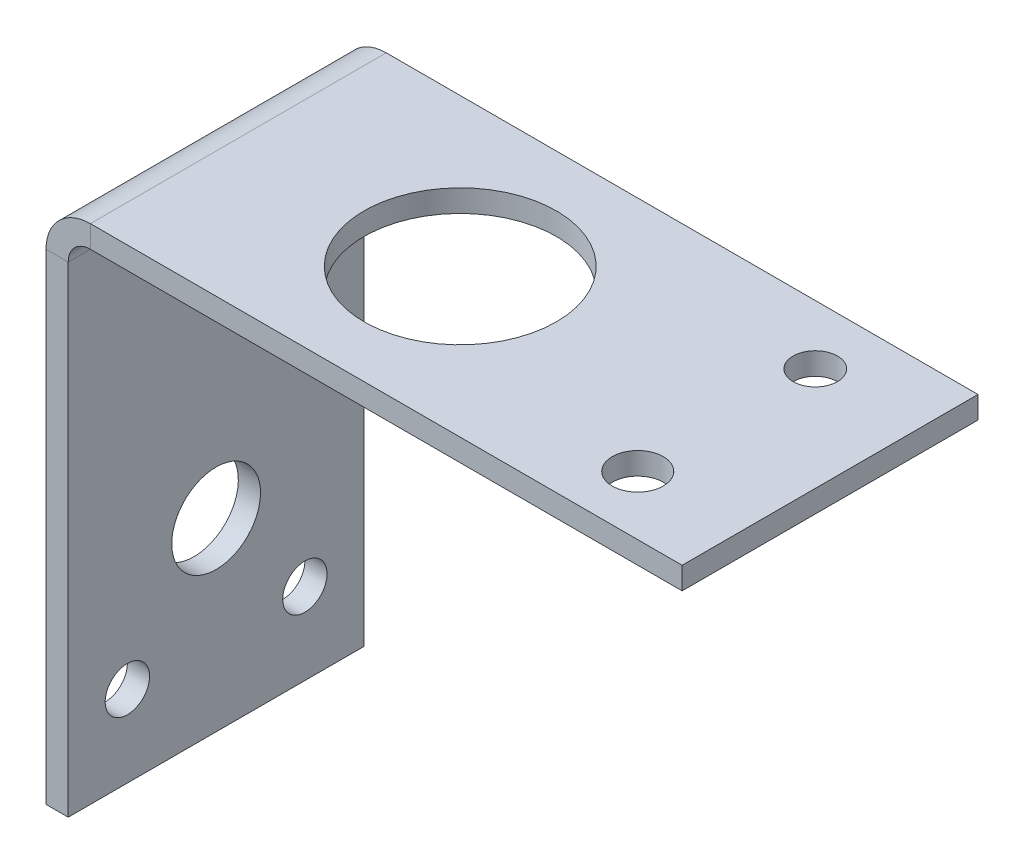
ISO-10303-21;
HEADER;
FILE_DESCRIPTION(('STEP AP214'),'2;1');
FILE_NAME('part.step','',(''),(''),'','','');
FILE_SCHEMA(('AUTOMOTIVE_DESIGN { 1 0 10303 214 1 1 1 1 }'));
ENDSEC;
DATA;
#1=APPLICATION_CONTEXT('core data for automotive mechanical design processes');
#2=APPLICATION_PROTOCOL_DEFINITION('international standard','automotive_design',2000,#1);
#3=PRODUCT_CONTEXT('',#1,'mechanical');
#4=PRODUCT('Part','Part','',(#3));
#5=PRODUCT_RELATED_PRODUCT_CATEGORY('part','',(#4));
#6=PRODUCT_DEFINITION_FORMATION('','',#4);
#7=PRODUCT_DEFINITION_CONTEXT('part definition',#1,'design');
#8=PRODUCT_DEFINITION('design','',#6,#7);
#9=PRODUCT_DEFINITION_SHAPE('','',#8);
#10=(LENGTH_UNIT() NAMED_UNIT(*) SI_UNIT(.MILLI.,.METRE.));
#11=(NAMED_UNIT(*) PLANE_ANGLE_UNIT() SI_UNIT($,.RADIAN.));
#12=(NAMED_UNIT(*) SI_UNIT($,.STERADIAN.) SOLID_ANGLE_UNIT());
#13=UNCERTAINTY_MEASURE_WITH_UNIT(LENGTH_MEASURE(1.E-05),#10,'distance_accuracy_value','');
#14=(GEOMETRIC_REPRESENTATION_CONTEXT(3) GLOBAL_UNCERTAINTY_ASSIGNED_CONTEXT((#13)) GLOBAL_UNIT_ASSIGNED_CONTEXT((#10,
#11,#12)) REPRESENTATION_CONTEXT('',''));
#15=CARTESIAN_POINT('',(0.,0.,0.));
#16=DIRECTION('',(0.,0.,1.));
#17=DIRECTION('',(1.,0.,0.));
#18=AXIS2_PLACEMENT_3D('',#15,#16,#17);
#19=CARTESIAN_POINT('',(-83.,-3.00000000000001,40.));
#20=DIRECTION('',(0.,0.,1.));
#21=DIRECTION('',(1.,0.,0.));
#22=AXIS2_PLACEMENT_3D('',#19,#20,#21);
#23=PLANE('',#22);
#24=DIRECTION('',(-1.,0.,0.));
#25=VECTOR('',#24,1.);
#26=CARTESIAN_POINT('',(-83.,-3.00000000000001,40.));
#27=LINE('',#26,#25);
#28=CARTESIAN_POINT('',(-83.,-3.00000000000001,40.));
#29=VERTEX_POINT('',#28);
#30=CARTESIAN_POINT('',(-86.,-3.00000000000001,40.));
#31=VERTEX_POINT('',#30);
#32=EDGE_CURVE('E11',#29,#31,#27,.T.);
#33=ORIENTED_EDGE('',*,*,#32,.F.);
#34=CARTESIAN_POINT('',(-80.,-3.00000000000001,40.));
#35=DIRECTION('',(0.,0.,-1.));
#36=DIRECTION('',(-1.,0.,0.));
#37=AXIS2_PLACEMENT_3D('',#34,#35,#36);
#38=CIRCLE('',#37,3.);
#39=CARTESIAN_POINT('',(-80.,0.,40.));
#40=VERTEX_POINT('',#39);
#41=EDGE_CURVE('E141',#40,#29,#38,.F.);
#42=ORIENTED_EDGE('',*,*,#41,.F.);
#43=DIRECTION('',(0.,-1.,0.));
#44=VECTOR('',#43,1.);
#45=CARTESIAN_POINT('',(-80.,2.99999999999999,40.));
#46=LINE('',#45,#44);
#47=CARTESIAN_POINT('',(-80.,2.99999999999999,40.));
#48=VERTEX_POINT('',#47);
#49=EDGE_CURVE('E51',#48,#40,#46,.T.);
#50=ORIENTED_EDGE('',*,*,#49,.F.);
#51=CARTESIAN_POINT('',(-80.,-3.00000000000001,40.));
#52=DIRECTION('',(0.,0.,1.));
#53=DIRECTION('',(1.,0.,0.));
#54=AXIS2_PLACEMENT_3D('',#51,#52,#53);
#55=CIRCLE('',#54,6.);
#56=EDGE_CURVE('E134',#48,#31,#55,.T.);
#57=ORIENTED_EDGE('',*,*,#56,.T.);
#58=EDGE_LOOP('',(#33,#42,#50,#57));
#59=FACE_BOUND('',#58,.T.);
#60=ADVANCED_FACE('F42',(#59),#23,.T.);
#61=CARTESIAN_POINT('',(-80.,2.99999999999999,40.));
#62=DIRECTION('',(0.,0.,1.));
#63=DIRECTION('',(1.,0.,0.));
#64=AXIS2_PLACEMENT_3D('',#61,#62,#63);
#65=PLANE('',#64);
#66=DIRECTION('',(0.,-1.,0.));
#67=VECTOR('',#66,1.);
#68=CARTESIAN_POINT('',(-83.,0.,40.));
#69=LINE('',#68,#67);
#70=CARTESIAN_POINT('',(-83.,-68.,40.));
#71=VERTEX_POINT('',#70);
#72=EDGE_CURVE('E223',#29,#71,#69,.T.);
#73=ORIENTED_EDGE('',*,*,#72,.F.);
#74=ORIENTED_EDGE('',*,*,#32,.T.);
#75=DIRECTION('',(0.,-1.,0.));
#76=VECTOR('',#75,1.);
#77=CARTESIAN_POINT('',(-86.,0.,40.));
#78=LINE('',#77,#76);
#79=CARTESIAN_POINT('',(-86.,-68.,40.));
#80=VERTEX_POINT('',#79);
#81=EDGE_CURVE('E100',#31,#80,#78,.T.);
#82=ORIENTED_EDGE('',*,*,#81,.T.);
#83=DIRECTION('',(-1.,0.,0.));
#84=VECTOR('',#83,1.);
#85=CARTESIAN_POINT('',(-83.,-68.,40.));
#86=LINE('',#85,#84);
#87=EDGE_CURVE('E220',#71,#80,#86,.T.);
#88=ORIENTED_EDGE('',*,*,#87,.F.);
#89=EDGE_LOOP('',(#73,#74,#82,#88));
#90=FACE_BOUND('',#89,.T.);
#91=ADVANCED_FACE('F243',(#90),#65,.T.);
#92=CARTESIAN_POINT('',(-80.,0.,0.));
#93=DIRECTION('',(0.,0.,-1.));
#94=DIRECTION('',(-1.,0.,0.));
#95=AXIS2_PLACEMENT_3D('',#92,#93,#94);
#96=PLANE('',#95);
#97=DIRECTION('',(0.,1.,0.));
#98=VECTOR('',#97,1.);
#99=CARTESIAN_POINT('',(-80.,0.,0.));
#100=LINE('',#99,#98);
#101=CARTESIAN_POINT('',(-80.,0.,0.));
#102=VERTEX_POINT('',#101);
#103=CARTESIAN_POINT('',(-80.,2.99999999999999,0.));
#104=VERTEX_POINT('',#103);
#105=EDGE_CURVE('E87',#102,#104,#100,.T.);
#106=ORIENTED_EDGE('',*,*,#105,.F.);
#107=CARTESIAN_POINT('',(-80.,-3.00000000000001,0.));
#108=DIRECTION('',(0.,0.,-1.));
#109=DIRECTION('',(-1.,0.,0.));
#110=AXIS2_PLACEMENT_3D('',#107,#108,#109);
#111=CIRCLE('',#110,3.);
#112=CARTESIAN_POINT('',(-83.,-3.00000000000001,0.));
#113=VERTEX_POINT('',#112);
#114=EDGE_CURVE('E157',#102,#113,#111,.F.);
#115=ORIENTED_EDGE('',*,*,#114,.T.);
#116=DIRECTION('',(1.,0.,0.));
#117=VECTOR('',#116,1.);
#118=CARTESIAN_POINT('',(-86.,-3.00000000000001,0.));
#119=LINE('',#118,#117);
#120=CARTESIAN_POINT('',(-86.,-3.00000000000001,0.));
#121=VERTEX_POINT('',#120);
#122=EDGE_CURVE('E94',#121,#113,#119,.T.);
#123=ORIENTED_EDGE('',*,*,#122,.F.);
#124=CARTESIAN_POINT('',(-80.,-3.00000000000001,0.));
#125=DIRECTION('',(0.,0.,1.));
#126=DIRECTION('',(1.,0.,0.));
#127=AXIS2_PLACEMENT_3D('',#124,#125,#126);
#128=CIRCLE('',#127,6.);
#129=EDGE_CURVE('E164',#104,#121,#128,.T.);
#130=ORIENTED_EDGE('',*,*,#129,.F.);
#131=EDGE_LOOP('',(#106,#115,#123,#130));
#132=FACE_BOUND('',#131,.T.);
#133=ADVANCED_FACE('F241',(#132),#96,.T.);
#134=CARTESIAN_POINT('',(-86.,-3.00000000000001,0.));
#135=DIRECTION('',(0.,0.,-1.));
#136=DIRECTION('',(-1.,0.,0.));
#137=AXIS2_PLACEMENT_3D('',#134,#135,#136);
#138=PLANE('',#137);
#139=DIRECTION('',(-1.,0.,0.));
#140=VECTOR('',#139,1.);
#141=CARTESIAN_POINT('',(0.,0.,0.));
#142=LINE('',#141,#140);
#143=CARTESIAN_POINT('',(0.,0.,0.));
#144=VERTEX_POINT('',#143);
#145=EDGE_CURVE('E159',#144,#102,#142,.T.);
#146=ORIENTED_EDGE('',*,*,#145,.T.);
#147=ORIENTED_EDGE('',*,*,#105,.T.);
#148=DIRECTION('',(-1.,0.,0.));
#149=VECTOR('',#148,1.);
#150=CARTESIAN_POINT('',(0.,3.,0.));
#151=LINE('',#150,#149);
#152=CARTESIAN_POINT('',(0.,3.,0.));
#153=VERTEX_POINT('',#152);
#154=EDGE_CURVE('E162',#153,#104,#151,.T.);
#155=ORIENTED_EDGE('',*,*,#154,.F.);
#156=DIRECTION('',(0.,-1.,0.));
#157=VECTOR('',#156,1.);
#158=CARTESIAN_POINT('',(0.,3.,0.));
#159=LINE('',#158,#157);
#160=EDGE_CURVE('E122',#153,#144,#159,.T.);
#161=ORIENTED_EDGE('',*,*,#160,.T.);
#162=EDGE_LOOP('',(#146,#147,#155,#161));
#163=FACE_BOUND('',#162,.T.);
#164=ADVANCED_FACE('F237',(#163),#138,.T.);
#165=CARTESIAN_POINT('',(-86.,0.,40.));
#166=DIRECTION('',(1.,0.,0.));
#167=DIRECTION('',(0.,1.,0.));
#168=AXIS2_PLACEMENT_3D('',#165,#166,#167);
#169=PLANE('',#168);
#170=CARTESIAN_POINT('',(-86.,-57.,8.00000000000001));
#171=DIRECTION('',(1.,0.,0.));
#172=DIRECTION('',(0.,1.,0.));
#173=AXIS2_PLACEMENT_3D('',#170,#171,#172);
#174=CIRCLE('',#173,3.);
#175=CARTESIAN_POINT('',(-86.,-54.,8.00000000000001));
#176=VERTEX_POINT('',#175);
#177=EDGE_CURVE('E205',#176,#176,#174,.T.);
#178=ORIENTED_EDGE('',*,*,#177,.T.);
#179=EDGE_LOOP('',(#178));
#180=FACE_BOUND('',#179,.T.);
#181=CARTESIAN_POINT('',(-86.,-57.,32.));
#182=DIRECTION('',(1.,0.,0.));
#183=DIRECTION('',(0.,1.,0.));
#184=AXIS2_PLACEMENT_3D('',#181,#182,#183);
#185=CIRCLE('',#184,3.);
#186=CARTESIAN_POINT('',(-86.,-54.,32.));
#187=VERTEX_POINT('',#186);
#188=EDGE_CURVE('E200',#187,#187,#185,.T.);
#189=ORIENTED_EDGE('',*,*,#188,.T.);
#190=EDGE_LOOP('',(#189));
#191=FACE_BOUND('',#190,.T.);
#192=CARTESIAN_POINT('',(-86.,-43.,20.));
#193=DIRECTION('',(1.,0.,0.));
#194=DIRECTION('',(0.,1.,0.));
#195=AXIS2_PLACEMENT_3D('',#192,#193,#194);
#196=CIRCLE('',#195,6.);
#197=CARTESIAN_POINT('',(-86.,-37.,20.));
#198=VERTEX_POINT('',#197);
#199=EDGE_CURVE('E151',#198,#198,#196,.T.);
#200=ORIENTED_EDGE('',*,*,#199,.T.);
#201=EDGE_LOOP('',(#200));
#202=FACE_BOUND('',#201,.T.);
#203=DIRECTION('',(0.,-1.,0.));
#204=VECTOR('',#203,1.);
#205=CARTESIAN_POINT('',(-86.,0.,0.));
#206=LINE('',#205,#204);
#207=CARTESIAN_POINT('',(-86.,-68.,0.));
#208=VERTEX_POINT('',#207);
#209=EDGE_CURVE('E147',#121,#208,#206,.T.);
#210=ORIENTED_EDGE('',*,*,#209,.T.);
#211=DIRECTION('',(0.,0.,-1.));
#212=VECTOR('',#211,1.);
#213=CARTESIAN_POINT('',(-86.,-68.,40.));
#214=LINE('',#213,#212);
#215=EDGE_CURVE('E178',#80,#208,#214,.T.);
#216=ORIENTED_EDGE('',*,*,#215,.F.);
#217=ORIENTED_EDGE('',*,*,#81,.F.);
#218=DIRECTION('',(0.,0.,-1.));
#219=VECTOR('',#218,1.);
#220=CARTESIAN_POINT('',(-86.,-3.00000000000001,40.));
#221=LINE('',#220,#219);
#222=EDGE_CURVE('E146',#31,#121,#221,.T.);
#223=ORIENTED_EDGE('',*,*,#222,.T.);
#224=EDGE_LOOP('',(#210,#216,#217,#223));
#225=FACE_BOUND('',#224,.T.);
#226=ADVANCED_FACE('F249',(#180,#191,#202,#225),#169,.F.);
#227=CARTESIAN_POINT('',(-83.,-68.,40.));
#228=DIRECTION('',(0.,-1.,0.));
#229=DIRECTION('',(0.,0.,-1.));
#230=AXIS2_PLACEMENT_3D('',#227,#228,#229);
#231=PLANE('',#230);
#232=DIRECTION('',(-1.,0.,0.));
#233=VECTOR('',#232,1.);
#234=CARTESIAN_POINT('',(-83.,-68.,0.));
#235=LINE('',#234,#233);
#236=CARTESIAN_POINT('',(-83.,-68.,0.));
#237=VERTEX_POINT('',#236);
#238=EDGE_CURVE('E150',#237,#208,#235,.T.);
#239=ORIENTED_EDGE('',*,*,#238,.F.);
#240=DIRECTION('',(0.,0.,-1.));
#241=VECTOR('',#240,1.);
#242=CARTESIAN_POINT('',(-83.,-68.,40.));
#243=LINE('',#242,#241);
#244=EDGE_CURVE('E176',#71,#237,#243,.T.);
#245=ORIENTED_EDGE('',*,*,#244,.F.);
#246=ORIENTED_EDGE('',*,*,#87,.T.);
#247=ORIENTED_EDGE('',*,*,#215,.T.);
#248=EDGE_LOOP('',(#239,#245,#246,#247));
#249=FACE_BOUND('',#248,.T.);
#250=ADVANCED_FACE('F278',(#249),#231,.T.);
#251=CARTESIAN_POINT('',(-83.,0.,40.));
#252=DIRECTION('',(1.,0.,0.));
#253=DIRECTION('',(0.,1.,0.));
#254=AXIS2_PLACEMENT_3D('',#251,#252,#253);
#255=PLANE('',#254);
#256=CARTESIAN_POINT('',(-83.,-57.,8.00000000000001));
#257=DIRECTION('',(1.,0.,0.));
#258=DIRECTION('',(0.,1.,0.));
#259=AXIS2_PLACEMENT_3D('',#256,#257,#258);
#260=CIRCLE('',#259,3.);
#261=CARTESIAN_POINT('',(-83.,-54.,8.00000000000001));
#262=VERTEX_POINT('',#261);
#263=EDGE_CURVE('E197',#262,#262,#260,.T.);
#264=ORIENTED_EDGE('',*,*,#263,.F.);
#265=EDGE_LOOP('',(#264));
#266=FACE_BOUND('',#265,.T.);
#267=CARTESIAN_POINT('',(-83.,-57.,32.));
#268=DIRECTION('',(1.,0.,0.));
#269=DIRECTION('',(0.,1.,0.));
#270=AXIS2_PLACEMENT_3D('',#267,#268,#269);
#271=CIRCLE('',#270,3.);
#272=CARTESIAN_POINT('',(-83.,-54.,32.));
#273=VERTEX_POINT('',#272);
#274=EDGE_CURVE('E188',#273,#273,#271,.T.);
#275=ORIENTED_EDGE('',*,*,#274,.F.);
#276=EDGE_LOOP('',(#275));
#277=FACE_BOUND('',#276,.T.);
#278=CARTESIAN_POINT('',(-83.,-43.,20.));
#279=DIRECTION('',(1.,0.,0.));
#280=DIRECTION('',(0.,1.,0.));
#281=AXIS2_PLACEMENT_3D('',#278,#279,#280);
#282=CIRCLE('',#281,6.);
#283=CARTESIAN_POINT('',(-83.,-37.,20.));
#284=VERTEX_POINT('',#283);
#285=EDGE_CURVE('E212',#284,#284,#282,.T.);
#286=ORIENTED_EDGE('',*,*,#285,.F.);
#287=EDGE_LOOP('',(#286));
#288=FACE_BOUND('',#287,.T.);
#289=DIRECTION('',(0.,-1.,0.));
#290=VECTOR('',#289,1.);
#291=CARTESIAN_POINT('',(-83.,0.,0.));
#292=LINE('',#291,#290);
#293=EDGE_CURVE('E154',#113,#237,#292,.T.);
#294=ORIENTED_EDGE('',*,*,#293,.F.);
#295=DIRECTION('',(0.,0.,-1.));
#296=VECTOR('',#295,1.);
#297=CARTESIAN_POINT('',(-83.,-3.00000000000001,40.));
#298=LINE('',#297,#296);
#299=EDGE_CURVE('E173',#29,#113,#298,.T.);
#300=ORIENTED_EDGE('',*,*,#299,.F.);
#301=ORIENTED_EDGE('',*,*,#72,.T.);
#302=ORIENTED_EDGE('',*,*,#244,.T.);
#303=EDGE_LOOP('',(#294,#300,#301,#302));
#304=FACE_BOUND('',#303,.T.);
#305=ADVANCED_FACE('F283',(#266,#277,#288,#304),#255,.T.);
#306=CARTESIAN_POINT('',(-80.,-3.00000000000001,40.));
#307=DIRECTION('',(0.,0.,-1.));
#308=DIRECTION('',(-1.,0.,0.));
#309=AXIS2_PLACEMENT_3D('',#306,#307,#308);
#310=CYLINDRICAL_SURFACE('',#309,3.);
#311=ORIENTED_EDGE('',*,*,#114,.F.);
#312=DIRECTION('',(0.,0.,-1.));
#313=VECTOR('',#312,1.);
#314=CARTESIAN_POINT('',(-80.,0.,40.));
#315=LINE('',#314,#313);
#316=EDGE_CURVE('E170',#40,#102,#315,.T.);
#317=ORIENTED_EDGE('',*,*,#316,.F.);
#318=ORIENTED_EDGE('',*,*,#41,.T.);
#319=ORIENTED_EDGE('',*,*,#299,.T.);
#320=EDGE_LOOP('',(#311,#317,#318,#319));
#321=FACE_BOUND('',#320,.T.);
#322=ADVANCED_FACE('F230',(#321),#310,.F.);
#323=CARTESIAN_POINT('',(0.,0.,40.));
#324=DIRECTION('',(0.,-1.,0.));
#325=DIRECTION('',(1.,0.,0.));
#326=AXIS2_PLACEMENT_3D('',#323,#324,#325);
#327=PLANE('',#326);
#328=CARTESIAN_POINT('',(-14.,0.,7.99999999999999));
#329=DIRECTION('',(0.,-1.,0.));
#330=DIRECTION('',(1.,0.,0.));
#331=AXIS2_PLACEMENT_3D('',#328,#329,#330);
#332=CIRCLE('',#331,3.);
#333=CARTESIAN_POINT('',(-11.,0.,7.99999999999999));
#334=VERTEX_POINT('',#333);
#335=EDGE_CURVE('E184',#334,#334,#332,.T.);
#336=ORIENTED_EDGE('',*,*,#335,.F.);
#337=EDGE_LOOP('',(#336));
#338=FACE_BOUND('',#337,.T.);
#339=CARTESIAN_POINT('',(-14.,0.,32.));
#340=DIRECTION('',(0.,-1.,0.));
#341=DIRECTION('',(1.,0.,0.));
#342=AXIS2_PLACEMENT_3D('',#339,#340,#341);
#343=CIRCLE('',#342,3.44698957559251);
#344=CARTESIAN_POINT('',(-10.5530104244075,0.,32.));
#345=VERTEX_POINT('',#344);
#346=EDGE_CURVE('E190',#345,#345,#343,.T.);
#347=ORIENTED_EDGE('',*,*,#346,.F.);
#348=EDGE_LOOP('',(#347));
#349=FACE_BOUND('',#348,.T.);
#350=CARTESIAN_POINT('',(-50.0001015576311,0.,20.));
#351=DIRECTION('',(0.,-1.,0.));
#352=DIRECTION('',(1.,0.,0.));
#353=AXIS2_PLACEMENT_3D('',#350,#351,#352);
#354=CIRCLE('',#353,13.);
#355=CARTESIAN_POINT('',(-37.0001015576311,0.,20.));
#356=VERTEX_POINT('',#355);
#357=EDGE_CURVE('E208',#356,#356,#354,.T.);
#358=ORIENTED_EDGE('',*,*,#357,.F.);
#359=EDGE_LOOP('',(#358));
#360=FACE_BOUND('',#359,.T.);
#361=ORIENTED_EDGE('',*,*,#145,.F.);
#362=DIRECTION('',(0.,0.,-1.));
#363=VECTOR('',#362,1.);
#364=CARTESIAN_POINT('',(0.,0.,40.));
#365=LINE('',#364,#363);
#366=CARTESIAN_POINT('',(0.,0.,40.));
#367=VERTEX_POINT('',#366);
#368=EDGE_CURVE('E124',#367,#144,#365,.T.);
#369=ORIENTED_EDGE('',*,*,#368,.F.);
#370=DIRECTION('',(-1.,0.,0.));
#371=VECTOR('',#370,1.);
#372=CARTESIAN_POINT('',(0.,0.,40.));
#373=LINE('',#372,#371);
#374=EDGE_CURVE('E139',#367,#40,#373,.T.);
#375=ORIENTED_EDGE('',*,*,#374,.T.);
#376=ORIENTED_EDGE('',*,*,#316,.T.);
#377=EDGE_LOOP('',(#361,#369,#375,#376));
#378=FACE_BOUND('',#377,.T.);
#379=ADVANCED_FACE('F236',(#338,#349,#360,#378),#327,.T.);
#380=CARTESIAN_POINT('',(0.,3.,40.));
#381=DIRECTION('',(1.,0.,0.));
#382=DIRECTION('',(0.,1.,0.));
#383=AXIS2_PLACEMENT_3D('',#380,#381,#382);
#384=PLANE('',#383);
#385=ORIENTED_EDGE('',*,*,#160,.F.);
#386=DIRECTION('',(0.,0.,-1.));
#387=VECTOR('',#386,1.);
#388=CARTESIAN_POINT('',(0.,3.,40.));
#389=LINE('',#388,#387);
#390=CARTESIAN_POINT('',(0.,3.,40.));
#391=VERTEX_POINT('',#390);
#392=EDGE_CURVE('E116',#391,#153,#389,.T.);
#393=ORIENTED_EDGE('',*,*,#392,.F.);
#394=DIRECTION('',(0.,-1.,0.));
#395=VECTOR('',#394,1.);
#396=CARTESIAN_POINT('',(0.,3.,40.));
#397=LINE('',#396,#395);
#398=EDGE_CURVE('E120',#391,#367,#397,.T.);
#399=ORIENTED_EDGE('',*,*,#398,.T.);
#400=ORIENTED_EDGE('',*,*,#368,.T.);
#401=EDGE_LOOP('',(#385,#393,#399,#400));
#402=FACE_BOUND('',#401,.T.);
#403=ADVANCED_FACE('F118',(#402),#384,.T.);
#404=CARTESIAN_POINT('',(0.,3.,40.));
#405=DIRECTION('',(0.,-1.,0.));
#406=DIRECTION('',(1.,0.,0.));
#407=AXIS2_PLACEMENT_3D('',#404,#405,#406);
#408=PLANE('',#407);
#409=CARTESIAN_POINT('',(-14.,3.,7.99999999999999));
#410=DIRECTION('',(0.,-1.,0.));
#411=DIRECTION('',(1.,0.,0.));
#412=AXIS2_PLACEMENT_3D('',#409,#410,#411);
#413=CIRCLE('',#412,3.);
#414=CARTESIAN_POINT('',(-11.,3.,7.99999999999999));
#415=VERTEX_POINT('',#414);
#416=EDGE_CURVE('E45',#415,#415,#413,.T.);
#417=ORIENTED_EDGE('',*,*,#416,.T.);
#418=EDGE_LOOP('',(#417));
#419=FACE_BOUND('',#418,.T.);
#420=CARTESIAN_POINT('',(-14.,3.,32.));
#421=DIRECTION('',(0.,-1.,0.));
#422=DIRECTION('',(1.,0.,0.));
#423=AXIS2_PLACEMENT_3D('',#420,#421,#422);
#424=CIRCLE('',#423,3.44698957559251);
#425=CARTESIAN_POINT('',(-10.5530104244075,3.,32.));
#426=VERTEX_POINT('',#425);
#427=EDGE_CURVE('E182',#426,#426,#424,.T.);
#428=ORIENTED_EDGE('',*,*,#427,.T.);
#429=EDGE_LOOP('',(#428));
#430=FACE_BOUND('',#429,.T.);
#431=CARTESIAN_POINT('',(-50.0001015576311,3.,20.));
#432=DIRECTION('',(0.,-1.,0.));
#433=DIRECTION('',(1.,0.,0.));
#434=AXIS2_PLACEMENT_3D('',#431,#432,#433);
#435=CIRCLE('',#434,13.);
#436=CARTESIAN_POINT('',(-37.0001015576311,3.00000000000001,20.));
#437=VERTEX_POINT('',#436);
#438=EDGE_CURVE('E209',#437,#437,#435,.T.);
#439=ORIENTED_EDGE('',*,*,#438,.T.);
#440=EDGE_LOOP('',(#439));
#441=FACE_BOUND('',#440,.T.);
#442=ORIENTED_EDGE('',*,*,#154,.T.);
#443=DIRECTION('',(0.,0.,-1.));
#444=VECTOR('',#443,1.);
#445=CARTESIAN_POINT('',(-80.,2.99999999999999,40.));
#446=LINE('',#445,#444);
#447=EDGE_CURVE('E125',#48,#104,#446,.T.);
#448=ORIENTED_EDGE('',*,*,#447,.F.);
#449=DIRECTION('',(-1.,0.,0.));
#450=VECTOR('',#449,1.);
#451=CARTESIAN_POINT('',(0.,3.,40.));
#452=LINE('',#451,#450);
#453=EDGE_CURVE('E129',#391,#48,#452,.T.);
#454=ORIENTED_EDGE('',*,*,#453,.F.);
#455=ORIENTED_EDGE('',*,*,#392,.T.);
#456=EDGE_LOOP('',(#442,#448,#454,#455));
#457=FACE_BOUND('',#456,.T.);
#458=ADVANCED_FACE('F130',(#419,#430,#441,#457),#408,.F.);
#459=CARTESIAN_POINT('',(-80.,-3.00000000000001,40.));
#460=DIRECTION('',(0.,0.,-1.));
#461=DIRECTION('',(-1.,0.,0.));
#462=AXIS2_PLACEMENT_3D('',#459,#460,#461);
#463=CYLINDRICAL_SURFACE('',#462,6.);
#464=ORIENTED_EDGE('',*,*,#129,.T.);
#465=ORIENTED_EDGE('',*,*,#222,.F.);
#466=ORIENTED_EDGE('',*,*,#56,.F.);
#467=ORIENTED_EDGE('',*,*,#447,.T.);
#468=EDGE_LOOP('',(#464,#465,#466,#467));
#469=FACE_BOUND('',#468,.T.);
#470=ADVANCED_FACE('F239',(#469),#463,.T.);
#471=CARTESIAN_POINT('',(-80.,-3.00000000000001,40.));
#472=DIRECTION('',(0.,0.,-1.));
#473=DIRECTION('',(-1.,0.,0.));
#474=AXIS2_PLACEMENT_3D('',#471,#472,#473);
#475=PLANE('',#474);
#476=ORIENTED_EDGE('',*,*,#453,.T.);
#477=ORIENTED_EDGE('',*,*,#49,.T.);
#478=ORIENTED_EDGE('',*,*,#374,.F.);
#479=ORIENTED_EDGE('',*,*,#398,.F.);
#480=EDGE_LOOP('',(#476,#477,#478,#479));
#481=FACE_BOUND('',#480,.T.);
#482=ADVANCED_FACE('F137',(#481),#475,.F.);
#483=CARTESIAN_POINT('',(-80.,-3.00000000000001,0.));
#484=DIRECTION('',(0.,0.,-1.));
#485=DIRECTION('',(-1.,0.,0.));
#486=AXIS2_PLACEMENT_3D('',#483,#484,#485);
#487=PLANE('',#486);
#488=ORIENTED_EDGE('',*,*,#209,.F.);
#489=ORIENTED_EDGE('',*,*,#122,.T.);
#490=ORIENTED_EDGE('',*,*,#293,.T.);
#491=ORIENTED_EDGE('',*,*,#238,.T.);
#492=EDGE_LOOP('',(#488,#489,#490,#491));
#493=FACE_BOUND('',#492,.T.);
#494=ADVANCED_FACE('F327',(#493),#487,.T.);
#495=CARTESIAN_POINT('',(-86.,-43.,20.));
#496=DIRECTION('',(1.,0.,0.));
#497=DIRECTION('',(0.,1.,0.));
#498=AXIS2_PLACEMENT_3D('',#495,#496,#497);
#499=CYLINDRICAL_SURFACE('',#498,6.);
#500=CARTESIAN_POINT('',(-86.,-37.,20.));
#501=CARTESIAN_POINT('',(-85.96875,-37.,20.));
#502=CARTESIAN_POINT('',(-85.9375,-37.,20.));
#503=CARTESIAN_POINT('',(-85.875,-37.,20.));
#504=CARTESIAN_POINT('',(-85.84375,-37.,20.));
#505=CARTESIAN_POINT('',(-85.78125,-37.,20.));
#506=CARTESIAN_POINT('',(-85.75,-37.,20.));
#507=CARTESIAN_POINT('',(-85.6875,-37.,20.));
#508=CARTESIAN_POINT('',(-85.65625,-37.,20.));
#509=CARTESIAN_POINT('',(-85.59375,-37.,20.));
#510=CARTESIAN_POINT('',(-85.5625,-37.,20.));
#511=CARTESIAN_POINT('',(-85.5,-37.,20.));
#512=CARTESIAN_POINT('',(-85.46875,-37.,20.));
#513=CARTESIAN_POINT('',(-85.40625,-37.,20.));
#514=CARTESIAN_POINT('',(-85.375,-37.,20.));
#515=CARTESIAN_POINT('',(-85.3125,-37.,20.));
#516=CARTESIAN_POINT('',(-85.28125,-37.,20.));
#517=CARTESIAN_POINT('',(-85.21875,-37.,20.));
#518=CARTESIAN_POINT('',(-85.1875,-37.,20.));
#519=CARTESIAN_POINT('',(-85.125,-37.,20.));
#520=CARTESIAN_POINT('',(-85.09375,-37.,20.));
#521=CARTESIAN_POINT('',(-85.03125,-37.,20.));
#522=CARTESIAN_POINT('',(-85.,-37.,20.));
#523=CARTESIAN_POINT('',(-84.9375,-37.,20.));
#524=CARTESIAN_POINT('',(-84.90625,-37.,20.));
#525=CARTESIAN_POINT('',(-84.84375,-37.,20.));
#526=CARTESIAN_POINT('',(-84.8125,-37.,20.));
#527=CARTESIAN_POINT('',(-84.75,-37.,20.));
#528=CARTESIAN_POINT('',(-84.71875,-37.,20.));
#529=CARTESIAN_POINT('',(-84.65625,-37.,20.));
#530=CARTESIAN_POINT('',(-84.625,-37.,20.));
#531=CARTESIAN_POINT('',(-84.5625,-37.,20.));
#532=CARTESIAN_POINT('',(-84.53125,-37.,20.));
#533=CARTESIAN_POINT('',(-84.46875,-37.,20.));
#534=CARTESIAN_POINT('',(-84.4375,-37.,20.));
#535=CARTESIAN_POINT('',(-84.375,-37.,20.));
#536=CARTESIAN_POINT('',(-84.34375,-37.,20.));
#537=CARTESIAN_POINT('',(-84.28125,-37.,20.));
#538=CARTESIAN_POINT('',(-84.25,-37.,20.));
#539=CARTESIAN_POINT('',(-84.1875,-37.,20.));
#540=CARTESIAN_POINT('',(-84.15625,-37.,20.));
#541=CARTESIAN_POINT('',(-84.09375,-37.,20.));
#542=CARTESIAN_POINT('',(-84.0625,-37.,20.));
#543=CARTESIAN_POINT('',(-84.,-37.,20.));
#544=CARTESIAN_POINT('',(-83.96875,-37.,20.));
#545=CARTESIAN_POINT('',(-83.90625,-37.,20.));
#546=CARTESIAN_POINT('',(-83.875,-37.,20.));
#547=CARTESIAN_POINT('',(-83.8125,-37.,20.));
#548=CARTESIAN_POINT('',(-83.78125,-37.,20.));
#549=CARTESIAN_POINT('',(-83.71875,-37.,20.));
#550=CARTESIAN_POINT('',(-83.6875,-37.,20.));
#551=CARTESIAN_POINT('',(-83.625,-37.,20.));
#552=CARTESIAN_POINT('',(-83.59375,-37.,20.));
#553=CARTESIAN_POINT('',(-83.53125,-37.,20.));
#554=CARTESIAN_POINT('',(-83.5,-37.,20.));
#555=CARTESIAN_POINT('',(-83.4375,-37.,20.));
#556=CARTESIAN_POINT('',(-83.40625,-37.,20.));
#557=CARTESIAN_POINT('',(-83.34375,-37.,20.));
#558=CARTESIAN_POINT('',(-83.3125,-37.,20.));
#559=CARTESIAN_POINT('',(-83.25,-37.,20.));
#560=CARTESIAN_POINT('',(-83.21875,-37.,20.));
#561=CARTESIAN_POINT('',(-83.15625,-37.,20.));
#562=CARTESIAN_POINT('',(-83.125,-37.,20.));
#563=CARTESIAN_POINT('',(-83.0625,-37.,20.));
#564=CARTESIAN_POINT('',(-83.03125,-37.,20.));
#565=CARTESIAN_POINT('',(-83.,-37.,20.));
#566=B_SPLINE_CURVE_WITH_KNOTS('',3,(#500,#501,#502,#503,#504,#505,#506,#507,#508,#509,#510,
#511,#512,#513,#514,#515,#516,#517,#518,#519,#520,#521,#522,#523,#524,#525,#526,#527,#528,#529,
#530,#531,#532,#533,#534,#535,#536,#537,#538,#539,#540,#541,#542,#543,#544,#545,#546,#547,#548,
#549,#550,#551,#552,#553,#554,#555,#556,#557,#558,#559,#560,#561,#562,#563,#564,#565),
.UNSPECIFIED.,.F.,.F.,(4,2,2,2,2,2,2,2,2,2,2,2,2,2,2,2,2,2,2,2,2,2,2,2,2,2,2,2,2,2,2,2,4),(0.,
0.0937499999999897,0.187499999999993,0.281249999999997,0.375,0.468750000000004,
0.562499999999994,0.656249999999997,0.750000000000001,0.843750000000004,0.937500000000008,
1.03125,1.125,1.21875,1.31250000000001,1.40625000000001,1.5,1.59375,1.68750000000001,
1.78125000000001,1.87500000000002,1.96875000000002,2.06250000000001,2.15625000000001,
2.25000000000002,2.34375000000002,2.43750000000002,2.53125000000001,2.62500000000002,
2.71875000000002,2.81250000000002,2.90625000000003,3.00000000000002),.UNSPECIFIED.);
#567=EDGE_CURVE('BSEAM337',#198,#284,#566,.T.);
#568=ORIENTED_EDGE('',*,*,#199,.F.);
#569=ORIENTED_EDGE('',*,*,#285,.T.);
#570=ORIENTED_EDGE('',*,*,#567,.T.);
#571=ORIENTED_EDGE('',*,*,#567,.F.);
#572=EDGE_LOOP('',(#568,#570,#569,#571));
#573=FACE_BOUND('',#572,.T.);
#574=ADVANCED_FACE('F337',(#573),#499,.F.);
#575=CARTESIAN_POINT('',(-50.0001015576311,3.,20.));
#576=DIRECTION('',(0.,-1.,0.));
#577=DIRECTION('',(1.,0.,0.));
#578=AXIS2_PLACEMENT_3D('',#575,#576,#577);
#579=CYLINDRICAL_SURFACE('',#578,13.);
#580=ORIENTED_EDGE('',*,*,#438,.F.);
#581=EDGE_LOOP('',(#580));
#582=FACE_BOUND('',#581,.T.);
#583=ORIENTED_EDGE('',*,*,#357,.T.);
#584=EDGE_LOOP('',(#583));
#585=FACE_BOUND('',#584,.T.);
#586=ADVANCED_FACE('F348',(#582,#585),#579,.F.);
#587=CARTESIAN_POINT('',(-93.,-57.,32.));
#588=DIRECTION('',(1.,0.,0.));
#589=DIRECTION('',(0.,1.,0.));
#590=AXIS2_PLACEMENT_3D('',#587,#588,#589);
#591=CYLINDRICAL_SURFACE('',#590,3.);
#592=ORIENTED_EDGE('',*,*,#274,.T.);
#593=EDGE_LOOP('',(#592));
#594=FACE_BOUND('',#593,.T.);
#595=ORIENTED_EDGE('',*,*,#188,.F.);
#596=EDGE_LOOP('',(#595));
#597=FACE_BOUND('',#596,.T.);
#598=ADVANCED_FACE('F359',(#594,#597),#591,.F.);
#599=CARTESIAN_POINT('',(-93.,-57.,8.00000000000001));
#600=DIRECTION('',(1.,0.,0.));
#601=DIRECTION('',(0.,1.,0.));
#602=AXIS2_PLACEMENT_3D('',#599,#600,#601);
#603=CYLINDRICAL_SURFACE('',#602,3.);
#604=ORIENTED_EDGE('',*,*,#263,.T.);
#605=EDGE_LOOP('',(#604));
#606=FACE_BOUND('',#605,.T.);
#607=ORIENTED_EDGE('',*,*,#177,.F.);
#608=EDGE_LOOP('',(#607));
#609=FACE_BOUND('',#608,.T.);
#610=ADVANCED_FACE('F380',(#606,#609),#603,.F.);
#611=CARTESIAN_POINT('',(-14.,10.,32.));
#612=DIRECTION('',(0.,-1.,0.));
#613=DIRECTION('',(1.,0.,0.));
#614=AXIS2_PLACEMENT_3D('',#611,#612,#613);
#615=CYLINDRICAL_SURFACE('',#614,3.44698957559251);
#616=ORIENTED_EDGE('',*,*,#346,.T.);
#617=EDGE_LOOP('',(#616));
#618=FACE_BOUND('',#617,.T.);
#619=ORIENTED_EDGE('',*,*,#427,.F.);
#620=EDGE_LOOP('',(#619));
#621=FACE_BOUND('',#620,.T.);
#622=ADVANCED_FACE('F391',(#618,#621),#615,.F.);
#623=CARTESIAN_POINT('',(-14.,10.,7.99999999999999));
#624=DIRECTION('',(0.,-1.,0.));
#625=DIRECTION('',(1.,0.,0.));
#626=AXIS2_PLACEMENT_3D('',#623,#624,#625);
#627=CYLINDRICAL_SURFACE('',#626,3.);
#628=ORIENTED_EDGE('',*,*,#335,.T.);
#629=EDGE_LOOP('',(#628));
#630=FACE_BOUND('',#629,.T.);
#631=ORIENTED_EDGE('',*,*,#416,.F.);
#632=EDGE_LOOP('',(#631));
#633=FACE_BOUND('',#632,.T.);
#634=ADVANCED_FACE('F412',(#630,#633),#627,.F.);
#635=CLOSED_SHELL('',(#60,#91,#133,#164,#226,#250,#305,#322,#379,#403,#458,#470,#482,#494,#574,
#586,#598,#610,#622,#634));
#636=MANIFOLD_SOLID_BREP('B2',#635);
#637=ADVANCED_BREP_SHAPE_REPRESENTATION('',(#18,#636),#14);
#638=SHAPE_DEFINITION_REPRESENTATION(#9,#637);
ENDSEC;
END-ISO-10303-21;
